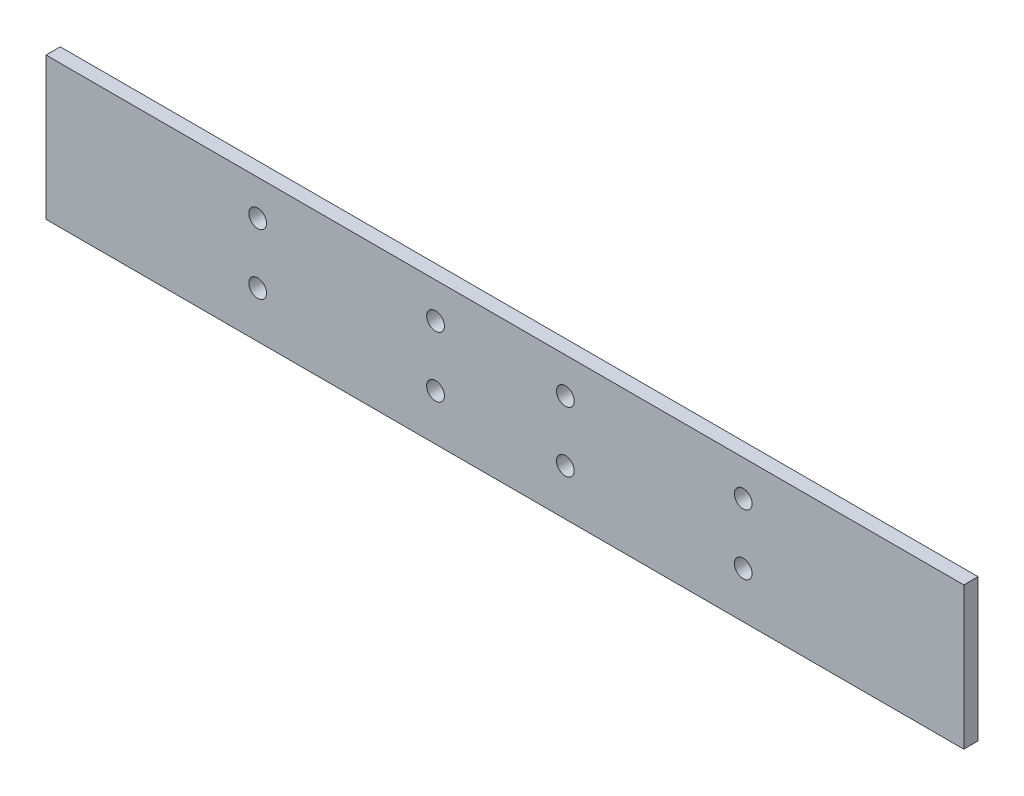
ISO-10303-21;
HEADER;
FILE_DESCRIPTION(('STEP AP214'),'2;1');
FILE_NAME('part.step','',(''),(''),'','','');
FILE_SCHEMA(('AUTOMOTIVE_DESIGN { 1 0 10303 214 1 1 1 1 }'));
ENDSEC;
DATA;
#1=APPLICATION_CONTEXT('core data for automotive mechanical design processes');
#2=APPLICATION_PROTOCOL_DEFINITION('international standard','automotive_design',2000,#1);
#3=PRODUCT_CONTEXT('',#1,'mechanical');
#4=PRODUCT('Part','Part','',(#3));
#5=PRODUCT_RELATED_PRODUCT_CATEGORY('part','',(#4));
#6=PRODUCT_DEFINITION_FORMATION('','',#4);
#7=PRODUCT_DEFINITION_CONTEXT('part definition',#1,'design');
#8=PRODUCT_DEFINITION('design','',#6,#7);
#9=PRODUCT_DEFINITION_SHAPE('','',#8);
#10=(LENGTH_UNIT() NAMED_UNIT(*) SI_UNIT(.MILLI.,.METRE.));
#11=(NAMED_UNIT(*) PLANE_ANGLE_UNIT() SI_UNIT($,.RADIAN.));
#12=(NAMED_UNIT(*) SI_UNIT($,.STERADIAN.) SOLID_ANGLE_UNIT());
#13=UNCERTAINTY_MEASURE_WITH_UNIT(LENGTH_MEASURE(1.E-05),#10,'distance_accuracy_value','');
#14=(GEOMETRIC_REPRESENTATION_CONTEXT(3) GLOBAL_UNCERTAINTY_ASSIGNED_CONTEXT((#13)) GLOBAL_UNIT_ASSIGNED_CONTEXT((#10,
#11,#12)) REPRESENTATION_CONTEXT('',''));
#15=CARTESIAN_POINT('',(0.,0.,0.));
#16=DIRECTION('',(0.,0.,1.));
#17=DIRECTION('',(1.,0.,0.));
#18=AXIS2_PLACEMENT_3D('',#15,#16,#17);
#19=CARTESIAN_POINT('',(0.,0.,4.));
#20=DIRECTION('',(0.,0.,-1.));
#21=DIRECTION('',(-1.,0.,0.));
#22=AXIS2_PLACEMENT_3D('',#19,#20,#21);
#23=PLANE('',#22);
#24=DIRECTION('',(0.,1.,0.));
#25=VECTOR('',#24,1.);
#26=CARTESIAN_POINT('',(129.,-20.,4.));
#27=LINE('',#26,#25);
#28=CARTESIAN_POINT('',(129.,-20.,4.));
#29=VERTEX_POINT('',#28);
#30=CARTESIAN_POINT('',(129.,20.,4.));
#31=VERTEX_POINT('',#30);
#32=EDGE_CURVE('E86',#29,#31,#27,.T.);
#33=ORIENTED_EDGE('',*,*,#32,.T.);
#34=DIRECTION('',(-1.,0.,0.));
#35=VECTOR('',#34,1.);
#36=CARTESIAN_POINT('',(-129.,20.,4.));
#37=LINE('',#36,#35);
#38=CARTESIAN_POINT('',(-129.,20.,4.));
#39=VERTEX_POINT('',#38);
#40=EDGE_CURVE('E81',#31,#39,#37,.T.);
#41=ORIENTED_EDGE('',*,*,#40,.T.);
#42=DIRECTION('',(0.,-1.,0.));
#43=VECTOR('',#42,1.);
#44=CARTESIAN_POINT('',(-129.,-20.,4.));
#45=LINE('',#44,#43);
#46=CARTESIAN_POINT('',(-129.,-20.,4.));
#47=VERTEX_POINT('',#46);
#48=EDGE_CURVE('E84',#39,#47,#45,.T.);
#49=ORIENTED_EDGE('',*,*,#48,.T.);
#50=DIRECTION('',(1.,0.,0.));
#51=VECTOR('',#50,1.);
#52=CARTESIAN_POINT('',(-129.,-20.,4.));
#53=LINE('',#52,#51);
#54=EDGE_CURVE('E51',#47,#29,#53,.T.);
#55=ORIENTED_EDGE('',*,*,#54,.T.);
#56=EDGE_LOOP('',(#33,#41,#49,#55));
#57=FACE_BOUND('',#56,.T.);
#58=CARTESIAN_POINT('',(-69.5,10.,4.));
#59=DIRECTION('',(0.,0.,1.));
#60=DIRECTION('',(1.,0.,0.));
#61=AXIS2_PLACEMENT_3D('',#58,#59,#60);
#62=CIRCLE('',#61,2.5);
#63=CARTESIAN_POINT('',(-67.,10.,4.));
#64=VERTEX_POINT('',#63);
#65=EDGE_CURVE('E101',#64,#64,#62,.T.);
#66=ORIENTED_EDGE('',*,*,#65,.F.);
#67=EDGE_LOOP('',(#66));
#68=FACE_BOUND('',#67,.T.);
#69=CARTESIAN_POINT('',(-19.5,10.,4.));
#70=DIRECTION('',(0.,0.,1.));
#71=DIRECTION('',(1.,0.,0.));
#72=AXIS2_PLACEMENT_3D('',#69,#70,#71);
#73=CIRCLE('',#72,2.5);
#74=CARTESIAN_POINT('',(-17.,10.,4.));
#75=VERTEX_POINT('',#74);
#76=EDGE_CURVE('E116',#75,#75,#73,.T.);
#77=ORIENTED_EDGE('',*,*,#76,.F.);
#78=EDGE_LOOP('',(#77));
#79=FACE_BOUND('',#78,.T.);
#80=CARTESIAN_POINT('',(17.,10.,4.));
#81=DIRECTION('',(0.,0.,1.));
#82=DIRECTION('',(-1.,0.,0.));
#83=AXIS2_PLACEMENT_3D('',#80,#81,#82);
#84=CIRCLE('',#83,2.5);
#85=CARTESIAN_POINT('',(14.5,10.,4.));
#86=VERTEX_POINT('',#85);
#87=EDGE_CURVE('E122',#86,#86,#84,.T.);
#88=ORIENTED_EDGE('',*,*,#87,.F.);
#89=EDGE_LOOP('',(#88));
#90=FACE_BOUND('',#89,.T.);
#91=CARTESIAN_POINT('',(67.,10.,4.));
#92=DIRECTION('',(0.,0.,1.));
#93=DIRECTION('',(-1.,0.,0.));
#94=AXIS2_PLACEMENT_3D('',#91,#92,#93);
#95=CIRCLE('',#94,2.5);
#96=CARTESIAN_POINT('',(64.5,10.,4.));
#97=VERTEX_POINT('',#96);
#98=EDGE_CURVE('E128',#97,#97,#95,.T.);
#99=ORIENTED_EDGE('',*,*,#98,.F.);
#100=EDGE_LOOP('',(#99));
#101=FACE_BOUND('',#100,.T.);
#102=CARTESIAN_POINT('',(-69.5,-7.,4.));
#103=DIRECTION('',(0.,0.,1.));
#104=DIRECTION('',(1.,0.,0.));
#105=AXIS2_PLACEMENT_3D('',#102,#103,#104);
#106=CIRCLE('',#105,2.5);
#107=CARTESIAN_POINT('',(-67.,-7.,4.));
#108=VERTEX_POINT('',#107);
#109=EDGE_CURVE('E134',#108,#108,#106,.T.);
#110=ORIENTED_EDGE('',*,*,#109,.F.);
#111=EDGE_LOOP('',(#110));
#112=FACE_BOUND('',#111,.T.);
#113=CARTESIAN_POINT('',(-19.5,-7.,4.));
#114=DIRECTION('',(0.,0.,1.));
#115=DIRECTION('',(1.,0.,0.));
#116=AXIS2_PLACEMENT_3D('',#113,#114,#115);
#117=CIRCLE('',#116,2.5);
#118=CARTESIAN_POINT('',(-17.,-7.,4.));
#119=VERTEX_POINT('',#118);
#120=EDGE_CURVE('E140',#119,#119,#117,.T.);
#121=ORIENTED_EDGE('',*,*,#120,.F.);
#122=EDGE_LOOP('',(#121));
#123=FACE_BOUND('',#122,.T.);
#124=CARTESIAN_POINT('',(17.,-7.,4.));
#125=DIRECTION('',(0.,0.,1.));
#126=DIRECTION('',(-1.,0.,0.));
#127=AXIS2_PLACEMENT_3D('',#124,#125,#126);
#128=CIRCLE('',#127,2.5);
#129=CARTESIAN_POINT('',(14.5,-7.,4.));
#130=VERTEX_POINT('',#129);
#131=EDGE_CURVE('E146',#130,#130,#128,.T.);
#132=ORIENTED_EDGE('',*,*,#131,.F.);
#133=EDGE_LOOP('',(#132));
#134=FACE_BOUND('',#133,.T.);
#135=CARTESIAN_POINT('',(67.,-7.,4.));
#136=DIRECTION('',(0.,0.,1.));
#137=DIRECTION('',(-1.,0.,0.));
#138=AXIS2_PLACEMENT_3D('',#135,#136,#137);
#139=CIRCLE('',#138,2.5);
#140=CARTESIAN_POINT('',(64.5,-7.,4.));
#141=VERTEX_POINT('',#140);
#142=EDGE_CURVE('E152',#141,#141,#139,.T.);
#143=ORIENTED_EDGE('',*,*,#142,.F.);
#144=EDGE_LOOP('',(#143));
#145=FACE_BOUND('',#144,.T.);
#146=ADVANCED_FACE('F34',(#57,#68,#79,#90,#101,#112,#123,#134,#145),#23,.F.);
#147=CARTESIAN_POINT('',(0.,0.,0.));
#148=DIRECTION('',(0.,0.,-1.));
#149=DIRECTION('',(-1.,0.,0.));
#150=AXIS2_PLACEMENT_3D('',#147,#148,#149);
#151=PLANE('',#150);
#152=CARTESIAN_POINT('',(17.,-7.,0.));
#153=DIRECTION('',(0.,0.,1.));
#154=DIRECTION('',(-1.,0.,0.));
#155=AXIS2_PLACEMENT_3D('',#152,#153,#154);
#156=CIRCLE('',#155,2.5);
#157=CARTESIAN_POINT('',(14.5,-7.,0.));
#158=VERTEX_POINT('',#157);
#159=EDGE_CURVE('E149',#158,#158,#156,.T.);
#160=ORIENTED_EDGE('',*,*,#159,.T.);
#161=EDGE_LOOP('',(#160));
#162=FACE_BOUND('',#161,.T.);
#163=CARTESIAN_POINT('',(-69.5,-7.,0.));
#164=DIRECTION('',(0.,0.,1.));
#165=DIRECTION('',(1.,0.,0.));
#166=AXIS2_PLACEMENT_3D('',#163,#164,#165);
#167=CIRCLE('',#166,2.5);
#168=CARTESIAN_POINT('',(-67.,-7.,0.));
#169=VERTEX_POINT('',#168);
#170=EDGE_CURVE('E137',#169,#169,#167,.T.);
#171=ORIENTED_EDGE('',*,*,#170,.T.);
#172=EDGE_LOOP('',(#171));
#173=FACE_BOUND('',#172,.T.);
#174=CARTESIAN_POINT('',(17.,10.,0.));
#175=DIRECTION('',(0.,0.,1.));
#176=DIRECTION('',(-1.,0.,0.));
#177=AXIS2_PLACEMENT_3D('',#174,#175,#176);
#178=CIRCLE('',#177,2.5);
#179=CARTESIAN_POINT('',(14.5,10.,0.));
#180=VERTEX_POINT('',#179);
#181=EDGE_CURVE('E125',#180,#180,#178,.T.);
#182=ORIENTED_EDGE('',*,*,#181,.T.);
#183=EDGE_LOOP('',(#182));
#184=FACE_BOUND('',#183,.T.);
#185=CARTESIAN_POINT('',(-69.5,10.,0.));
#186=DIRECTION('',(0.,0.,1.));
#187=DIRECTION('',(1.,0.,0.));
#188=AXIS2_PLACEMENT_3D('',#185,#186,#187);
#189=CIRCLE('',#188,2.5);
#190=CARTESIAN_POINT('',(-67.,10.,0.));
#191=VERTEX_POINT('',#190);
#192=EDGE_CURVE('E113',#191,#191,#189,.T.);
#193=ORIENTED_EDGE('',*,*,#192,.T.);
#194=EDGE_LOOP('',(#193));
#195=FACE_BOUND('',#194,.T.);
#196=DIRECTION('',(0.,1.,0.));
#197=VECTOR('',#196,1.);
#198=CARTESIAN_POINT('',(129.,-20.,0.));
#199=LINE('',#198,#197);
#200=CARTESIAN_POINT('',(129.,-20.,0.));
#201=VERTEX_POINT('',#200);
#202=CARTESIAN_POINT('',(129.,20.,0.));
#203=VERTEX_POINT('',#202);
#204=EDGE_CURVE('E98',#201,#203,#199,.T.);
#205=ORIENTED_EDGE('',*,*,#204,.F.);
#206=DIRECTION('',(1.,0.,0.));
#207=VECTOR('',#206,1.);
#208=CARTESIAN_POINT('',(-129.,-20.,0.));
#209=LINE('',#208,#207);
#210=CARTESIAN_POINT('',(-129.,-20.,0.));
#211=VERTEX_POINT('',#210);
#212=EDGE_CURVE('E74',#211,#201,#209,.T.);
#213=ORIENTED_EDGE('',*,*,#212,.F.);
#214=DIRECTION('',(0.,-1.,0.));
#215=VECTOR('',#214,1.);
#216=CARTESIAN_POINT('',(-129.,-20.,0.));
#217=LINE('',#216,#215);
#218=CARTESIAN_POINT('',(-129.,20.,0.));
#219=VERTEX_POINT('',#218);
#220=EDGE_CURVE('E68',#219,#211,#217,.T.);
#221=ORIENTED_EDGE('',*,*,#220,.F.);
#222=DIRECTION('',(-1.,0.,0.));
#223=VECTOR('',#222,1.);
#224=CARTESIAN_POINT('',(-129.,20.,0.));
#225=LINE('',#224,#223);
#226=EDGE_CURVE('E90',#203,#219,#225,.T.);
#227=ORIENTED_EDGE('',*,*,#226,.F.);
#228=EDGE_LOOP('',(#205,#213,#221,#227));
#229=FACE_BOUND('',#228,.T.);
#230=CARTESIAN_POINT('',(-19.5,10.,0.));
#231=DIRECTION('',(0.,0.,1.));
#232=DIRECTION('',(1.,0.,0.));
#233=AXIS2_PLACEMENT_3D('',#230,#231,#232);
#234=CIRCLE('',#233,2.5);
#235=CARTESIAN_POINT('',(-17.,10.,0.));
#236=VERTEX_POINT('',#235);
#237=EDGE_CURVE('E119',#236,#236,#234,.T.);
#238=ORIENTED_EDGE('',*,*,#237,.T.);
#239=EDGE_LOOP('',(#238));
#240=FACE_BOUND('',#239,.T.);
#241=CARTESIAN_POINT('',(67.,10.,0.));
#242=DIRECTION('',(0.,0.,1.));
#243=DIRECTION('',(-1.,0.,0.));
#244=AXIS2_PLACEMENT_3D('',#241,#242,#243);
#245=CIRCLE('',#244,2.5);
#246=CARTESIAN_POINT('',(64.5,10.,0.));
#247=VERTEX_POINT('',#246);
#248=EDGE_CURVE('E131',#247,#247,#245,.T.);
#249=ORIENTED_EDGE('',*,*,#248,.T.);
#250=EDGE_LOOP('',(#249));
#251=FACE_BOUND('',#250,.T.);
#252=CARTESIAN_POINT('',(-19.5,-7.,0.));
#253=DIRECTION('',(0.,0.,1.));
#254=DIRECTION('',(1.,0.,0.));
#255=AXIS2_PLACEMENT_3D('',#252,#253,#254);
#256=CIRCLE('',#255,2.5);
#257=CARTESIAN_POINT('',(-17.,-7.,0.));
#258=VERTEX_POINT('',#257);
#259=EDGE_CURVE('E143',#258,#258,#256,.T.);
#260=ORIENTED_EDGE('',*,*,#259,.T.);
#261=EDGE_LOOP('',(#260));
#262=FACE_BOUND('',#261,.T.);
#263=CARTESIAN_POINT('',(67.,-7.,0.));
#264=DIRECTION('',(0.,0.,1.));
#265=DIRECTION('',(-1.,0.,0.));
#266=AXIS2_PLACEMENT_3D('',#263,#264,#265);
#267=CIRCLE('',#266,2.5);
#268=CARTESIAN_POINT('',(64.5,-7.,0.));
#269=VERTEX_POINT('',#268);
#270=EDGE_CURVE('E155',#269,#269,#267,.T.);
#271=ORIENTED_EDGE('',*,*,#270,.T.);
#272=EDGE_LOOP('',(#271));
#273=FACE_BOUND('',#272,.T.);
#274=ADVANCED_FACE('F109',(#162,#173,#184,#195,#229,#240,#251,#262,#273),#151,.T.);
#275=CARTESIAN_POINT('',(129.,-20.,4.));
#276=DIRECTION('',(-1.,0.,0.));
#277=DIRECTION('',(0.,0.,1.));
#278=AXIS2_PLACEMENT_3D('',#275,#276,#277);
#279=PLANE('',#278);
#280=ORIENTED_EDGE('',*,*,#204,.T.);
#281=DIRECTION('',(0.,0.,-1.));
#282=VECTOR('',#281,1.);
#283=CARTESIAN_POINT('',(129.,20.,4.));
#284=LINE('',#283,#282);
#285=EDGE_CURVE('E11',#31,#203,#284,.T.);
#286=ORIENTED_EDGE('',*,*,#285,.F.);
#287=ORIENTED_EDGE('',*,*,#32,.F.);
#288=DIRECTION('',(0.,0.,-1.));
#289=VECTOR('',#288,1.);
#290=CARTESIAN_POINT('',(129.,-20.,4.));
#291=LINE('',#290,#289);
#292=EDGE_CURVE('E94',#29,#201,#291,.T.);
#293=ORIENTED_EDGE('',*,*,#292,.T.);
#294=EDGE_LOOP('',(#280,#286,#287,#293));
#295=FACE_BOUND('',#294,.T.);
#296=ADVANCED_FACE('F36',(#295),#279,.F.);
#297=CARTESIAN_POINT('',(-129.,20.,4.));
#298=DIRECTION('',(0.,-1.,0.));
#299=DIRECTION('',(0.,0.,-1.));
#300=AXIS2_PLACEMENT_3D('',#297,#298,#299);
#301=PLANE('',#300);
#302=ORIENTED_EDGE('',*,*,#226,.T.);
#303=DIRECTION('',(0.,0.,-1.));
#304=VECTOR('',#303,1.);
#305=CARTESIAN_POINT('',(-129.,20.,4.));
#306=LINE('',#305,#304);
#307=EDGE_CURVE('E43',#39,#219,#306,.T.);
#308=ORIENTED_EDGE('',*,*,#307,.F.);
#309=ORIENTED_EDGE('',*,*,#40,.F.);
#310=ORIENTED_EDGE('',*,*,#285,.T.);
#311=EDGE_LOOP('',(#302,#308,#309,#310));
#312=FACE_BOUND('',#311,.T.);
#313=ADVANCED_FACE('F89',(#312),#301,.F.);
#314=CARTESIAN_POINT('',(-129.,-20.,4.));
#315=DIRECTION('',(1.,0.,0.));
#316=DIRECTION('',(0.,0.,-1.));
#317=AXIS2_PLACEMENT_3D('',#314,#315,#316);
#318=PLANE('',#317);
#319=ORIENTED_EDGE('',*,*,#220,.T.);
#320=DIRECTION('',(0.,0.,-1.));
#321=VECTOR('',#320,1.);
#322=CARTESIAN_POINT('',(-129.,-20.,4.));
#323=LINE('',#322,#321);
#324=EDGE_CURVE('E91',#47,#211,#323,.T.);
#325=ORIENTED_EDGE('',*,*,#324,.F.);
#326=ORIENTED_EDGE('',*,*,#48,.F.);
#327=ORIENTED_EDGE('',*,*,#307,.T.);
#328=EDGE_LOOP('',(#319,#325,#326,#327));
#329=FACE_BOUND('',#328,.T.);
#330=ADVANCED_FACE('F92',(#329),#318,.F.);
#331=CARTESIAN_POINT('',(-129.,-20.,4.));
#332=DIRECTION('',(0.,1.,0.));
#333=DIRECTION('',(0.,0.,1.));
#334=AXIS2_PLACEMENT_3D('',#331,#332,#333);
#335=PLANE('',#334);
#336=ORIENTED_EDGE('',*,*,#212,.T.);
#337=ORIENTED_EDGE('',*,*,#292,.F.);
#338=ORIENTED_EDGE('',*,*,#54,.F.);
#339=ORIENTED_EDGE('',*,*,#324,.T.);
#340=EDGE_LOOP('',(#336,#337,#338,#339));
#341=FACE_BOUND('',#340,.T.);
#342=ADVANCED_FACE('F106',(#341),#335,.F.);
#343=CARTESIAN_POINT('',(-69.5,10.,4.));
#344=DIRECTION('',(0.,0.,-1.));
#345=DIRECTION('',(-1.,0.,0.));
#346=AXIS2_PLACEMENT_3D('',#343,#344,#345);
#347=CYLINDRICAL_SURFACE('',#346,2.5);
#348=ORIENTED_EDGE('',*,*,#65,.T.);
#349=EDGE_LOOP('',(#348));
#350=FACE_BOUND('',#349,.T.);
#351=ORIENTED_EDGE('',*,*,#192,.F.);
#352=EDGE_LOOP('',(#351));
#353=FACE_BOUND('',#352,.T.);
#354=ADVANCED_FACE('F172',(#350,#353),#347,.F.);
#355=CARTESIAN_POINT('',(-19.5,10.,4.));
#356=DIRECTION('',(0.,0.,-1.));
#357=DIRECTION('',(-1.,0.,0.));
#358=AXIS2_PLACEMENT_3D('',#355,#356,#357);
#359=CYLINDRICAL_SURFACE('',#358,2.5);
#360=ORIENTED_EDGE('',*,*,#76,.T.);
#361=EDGE_LOOP('',(#360));
#362=FACE_BOUND('',#361,.T.);
#363=ORIENTED_EDGE('',*,*,#237,.F.);
#364=EDGE_LOOP('',(#363));
#365=FACE_BOUND('',#364,.T.);
#366=ADVANCED_FACE('F218',(#362,#365),#359,.F.);
#367=CARTESIAN_POINT('',(17.,10.,4.));
#368=DIRECTION('',(0.,0.,-1.));
#369=DIRECTION('',(-1.,0.,0.));
#370=AXIS2_PLACEMENT_3D('',#367,#368,#369);
#371=CYLINDRICAL_SURFACE('',#370,2.5);
#372=ORIENTED_EDGE('',*,*,#87,.T.);
#373=EDGE_LOOP('',(#372));
#374=FACE_BOUND('',#373,.T.);
#375=ORIENTED_EDGE('',*,*,#181,.F.);
#376=EDGE_LOOP('',(#375));
#377=FACE_BOUND('',#376,.T.);
#378=ADVANCED_FACE('F226',(#374,#377),#371,.F.);
#379=CARTESIAN_POINT('',(67.,10.,4.));
#380=DIRECTION('',(0.,0.,-1.));
#381=DIRECTION('',(-1.,0.,0.));
#382=AXIS2_PLACEMENT_3D('',#379,#380,#381);
#383=CYLINDRICAL_SURFACE('',#382,2.5);
#384=ORIENTED_EDGE('',*,*,#98,.T.);
#385=EDGE_LOOP('',(#384));
#386=FACE_BOUND('',#385,.T.);
#387=ORIENTED_EDGE('',*,*,#248,.F.);
#388=EDGE_LOOP('',(#387));
#389=FACE_BOUND('',#388,.T.);
#390=ADVANCED_FACE('F234',(#386,#389),#383,.F.);
#391=CARTESIAN_POINT('',(-69.5,-7.,4.));
#392=DIRECTION('',(0.,0.,-1.));
#393=DIRECTION('',(-1.,0.,0.));
#394=AXIS2_PLACEMENT_3D('',#391,#392,#393);
#395=CYLINDRICAL_SURFACE('',#394,2.5);
#396=ORIENTED_EDGE('',*,*,#109,.T.);
#397=EDGE_LOOP('',(#396));
#398=FACE_BOUND('',#397,.T.);
#399=ORIENTED_EDGE('',*,*,#170,.F.);
#400=EDGE_LOOP('',(#399));
#401=FACE_BOUND('',#400,.T.);
#402=ADVANCED_FACE('F243',(#398,#401),#395,.F.);
#403=CARTESIAN_POINT('',(-19.5,-7.,4.));
#404=DIRECTION('',(0.,0.,-1.));
#405=DIRECTION('',(-1.,0.,0.));
#406=AXIS2_PLACEMENT_3D('',#403,#404,#405);
#407=CYLINDRICAL_SURFACE('',#406,2.5);
#408=ORIENTED_EDGE('',*,*,#120,.T.);
#409=EDGE_LOOP('',(#408));
#410=FACE_BOUND('',#409,.T.);
#411=ORIENTED_EDGE('',*,*,#259,.F.);
#412=EDGE_LOOP('',(#411));
#413=FACE_BOUND('',#412,.T.);
#414=ADVANCED_FACE('F252',(#410,#413),#407,.F.);
#415=CARTESIAN_POINT('',(17.,-7.,4.));
#416=DIRECTION('',(0.,0.,-1.));
#417=DIRECTION('',(-1.,0.,0.));
#418=AXIS2_PLACEMENT_3D('',#415,#416,#417);
#419=CYLINDRICAL_SURFACE('',#418,2.5);
#420=ORIENTED_EDGE('',*,*,#131,.T.);
#421=EDGE_LOOP('',(#420));
#422=FACE_BOUND('',#421,.T.);
#423=ORIENTED_EDGE('',*,*,#159,.F.);
#424=EDGE_LOOP('',(#423));
#425=FACE_BOUND('',#424,.T.);
#426=ADVANCED_FACE('F261',(#422,#425),#419,.F.);
#427=CARTESIAN_POINT('',(67.,-7.,4.));
#428=DIRECTION('',(0.,0.,-1.));
#429=DIRECTION('',(-1.,0.,0.));
#430=AXIS2_PLACEMENT_3D('',#427,#428,#429);
#431=CYLINDRICAL_SURFACE('',#430,2.5);
#432=ORIENTED_EDGE('',*,*,#142,.T.);
#433=EDGE_LOOP('',(#432));
#434=FACE_BOUND('',#433,.T.);
#435=ORIENTED_EDGE('',*,*,#270,.F.);
#436=EDGE_LOOP('',(#435));
#437=FACE_BOUND('',#436,.T.);
#438=ADVANCED_FACE('F161',(#434,#437),#431,.F.);
#439=CLOSED_SHELL('',(#146,#274,#296,#313,#330,#342,#354,#366,#378,#390,#402,#414,#426,#438));
#440=MANIFOLD_SOLID_BREP('B2',#439);
#441=ADVANCED_BREP_SHAPE_REPRESENTATION('',(#18,#440),#14);
#442=SHAPE_DEFINITION_REPRESENTATION(#9,#441);
ENDSEC;
END-ISO-10303-21;
